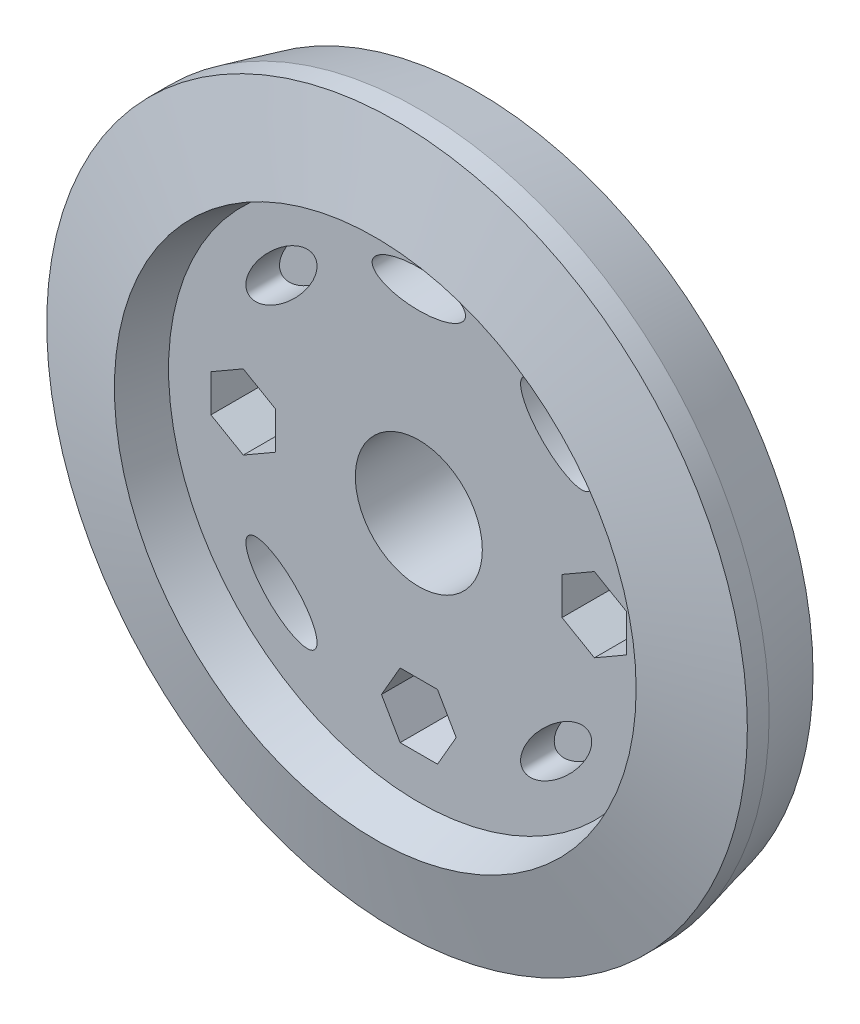
ISO-10303-21;
HEADER;
FILE_DESCRIPTION(('STEP AP214'),'2;1');
FILE_NAME('part.step','',(''),(''),'','','');
FILE_SCHEMA(('AUTOMOTIVE_DESIGN { 1 0 10303 214 1 1 1 1 }'));
ENDSEC;
DATA;
#1=APPLICATION_CONTEXT('core data for automotive mechanical design processes');
#2=APPLICATION_PROTOCOL_DEFINITION('international standard','automotive_design',2000,#1);
#3=PRODUCT_CONTEXT('',#1,'mechanical');
#4=PRODUCT('Part','Part','',(#3));
#5=PRODUCT_RELATED_PRODUCT_CATEGORY('part','',(#4));
#6=PRODUCT_DEFINITION_FORMATION('','',#4);
#7=PRODUCT_DEFINITION_CONTEXT('part definition',#1,'design');
#8=PRODUCT_DEFINITION('design','',#6,#7);
#9=PRODUCT_DEFINITION_SHAPE('','',#8);
#10=(LENGTH_UNIT() NAMED_UNIT(*) SI_UNIT(.MILLI.,.METRE.));
#11=(NAMED_UNIT(*) PLANE_ANGLE_UNIT() SI_UNIT($,.RADIAN.));
#12=(NAMED_UNIT(*) SI_UNIT($,.STERADIAN.) SOLID_ANGLE_UNIT());
#13=UNCERTAINTY_MEASURE_WITH_UNIT(LENGTH_MEASURE(1.E-05),#10,'distance_accuracy_value','');
#14=(GEOMETRIC_REPRESENTATION_CONTEXT(3) GLOBAL_UNCERTAINTY_ASSIGNED_CONTEXT((#13)) GLOBAL_UNIT_ASSIGNED_CONTEXT((#10,
#11,#12)) REPRESENTATION_CONTEXT('',''));
#15=CARTESIAN_POINT('',(0.,0.,0.));
#16=DIRECTION('',(0.,0.,1.));
#17=DIRECTION('',(1.,0.,0.));
#18=AXIS2_PLACEMENT_3D('',#15,#16,#17);
#19=CARTESIAN_POINT('',(0.,1701.8,394.866836272027));
#20=DIRECTION('',(0.,0.,-1.));
#21=DIRECTION('',(-1.,0.,0.));
#22=AXIS2_PLACEMENT_3D('',#19,#20,#21);
#23=PLANE('',#22);
#24=DIRECTION('',(-0.5,0.866025403784438,0.));
#25=VECTOR('',#24,1.);
#26=CARTESIAN_POINT('',(254.,-1193.8,394.866836272027));
#27=LINE('',#26,#25);
#28=CARTESIAN_POINT('',(254.,-1193.8,394.866836272027));
#29=VERTEX_POINT('',#28);
#30=CARTESIAN_POINT('',(127.,-973.829547438753,394.866836272027));
#31=VERTEX_POINT('',#30);
#32=EDGE_CURVE('E180',#29,#31,#27,.T.);
#33=ORIENTED_EDGE('',*,*,#32,.F.);
#34=DIRECTION('',(0.5,0.866025403784439,0.));
#35=VECTOR('',#34,1.);
#36=CARTESIAN_POINT('',(127.,-1413.77045256125,394.866836272027));
#37=LINE('',#36,#35);
#38=CARTESIAN_POINT('',(127.,-1413.77045256125,394.866836272027));
#39=VERTEX_POINT('',#38);
#40=EDGE_CURVE('E53',#39,#29,#37,.T.);
#41=ORIENTED_EDGE('',*,*,#40,.F.);
#42=DIRECTION('',(1.,0.,0.));
#43=VECTOR('',#42,1.);
#44=CARTESIAN_POINT('',(-127.,-1413.77045256125,394.866836272027));
#45=LINE('',#44,#43);
#46=CARTESIAN_POINT('',(-127.,-1413.77045256125,394.866836272027));
#47=VERTEX_POINT('',#46);
#48=EDGE_CURVE('E195',#47,#39,#45,.T.);
#49=ORIENTED_EDGE('',*,*,#48,.F.);
#50=DIRECTION('',(0.5,-0.866025403784439,0.));
#51=VECTOR('',#50,1.);
#52=CARTESIAN_POINT('',(-254.,-1193.8,394.866836272027));
#53=LINE('',#52,#51);
#54=CARTESIAN_POINT('',(-254.,-1193.8,394.866836272027));
#55=VERTEX_POINT('',#54);
#56=EDGE_CURVE('E189',#55,#47,#53,.T.);
#57=ORIENTED_EDGE('',*,*,#56,.F.);
#58=DIRECTION('',(-0.5,-0.866025403784439,0.));
#59=VECTOR('',#58,1.);
#60=CARTESIAN_POINT('',(-127.,-973.829547438753,394.866836272027));
#61=LINE('',#60,#59);
#62=CARTESIAN_POINT('',(-127.,-973.829547438753,394.866836272027));
#63=VERTEX_POINT('',#62);
#64=EDGE_CURVE('E187',#63,#55,#61,.T.);
#65=ORIENTED_EDGE('',*,*,#64,.F.);
#66=DIRECTION('',(-1.,0.,0.));
#67=VECTOR('',#66,1.);
#68=CARTESIAN_POINT('',(127.,-973.829547438753,394.866836272027));
#69=LINE('',#68,#67);
#70=EDGE_CURVE('E170',#31,#63,#69,.T.);
#71=ORIENTED_EDGE('',*,*,#70,.F.);
#72=EDGE_LOOP('',(#33,#41,#49,#57,#65,#71));
#73=FACE_BOUND('',#72,.T.);
#74=DIRECTION('',(0.86602540378444,0.499999999999997,0.));
#75=VECTOR('',#74,1.);
#76=CARTESIAN_POINT('',(-1193.8,-253.999999999996,394.866836272027));
#77=LINE('',#76,#75);
#78=CARTESIAN_POINT('',(-1193.8,-253.999999999996,394.866836272027));
#79=VERTEX_POINT('',#78);
#80=CARTESIAN_POINT('',(-973.829547438753,-126.999999999997,394.866836272027));
#81=VERTEX_POINT('',#80);
#82=EDGE_CURVE('E232',#79,#81,#77,.T.);
#83=ORIENTED_EDGE('',*,*,#82,.F.);
#84=DIRECTION('',(0.866025403784437,-0.500000000000003,0.));
#85=VECTOR('',#84,1.);
#86=CARTESIAN_POINT('',(-1413.77045256125,-126.999999999995,394.866836272027));
#87=LINE('',#86,#85);
#88=CARTESIAN_POINT('',(-1413.77045256125,-126.999999999995,394.866836272027));
#89=VERTEX_POINT('',#88);
#90=EDGE_CURVE('E61',#89,#79,#87,.T.);
#91=ORIENTED_EDGE('',*,*,#90,.F.);
#92=DIRECTION('',(0.,-1.,0.));
#93=VECTOR('',#92,1.);
#94=CARTESIAN_POINT('',(-1413.77045256125,127.000000000005,394.866836272027));
#95=LINE('',#94,#93);
#96=CARTESIAN_POINT('',(-1413.77045256125,127.000000000005,394.866836272027));
#97=VERTEX_POINT('',#96);
#98=EDGE_CURVE('E209',#97,#89,#95,.T.);
#99=ORIENTED_EDGE('',*,*,#98,.F.);
#100=DIRECTION('',(-0.86602540378444,-0.499999999999997,0.));
#101=VECTOR('',#100,1.);
#102=CARTESIAN_POINT('',(-1193.8,254.000000000004,394.866836272027));
#103=LINE('',#102,#101);
#104=CARTESIAN_POINT('',(-1193.8,254.000000000004,394.866836272027));
#105=VERTEX_POINT('',#104);
#106=EDGE_CURVE('E223',#105,#97,#103,.T.);
#107=ORIENTED_EDGE('',*,*,#106,.F.);
#108=DIRECTION('',(-0.866025403784437,0.500000000000003,0.));
#109=VECTOR('',#108,1.);
#110=CARTESIAN_POINT('',(-973.829547438752,127.000000000003,394.866836272027));
#111=LINE('',#110,#109);
#112=CARTESIAN_POINT('',(-973.829547438752,127.000000000003,394.866836272027));
#113=VERTEX_POINT('',#112);
#114=EDGE_CURVE('E226',#113,#105,#111,.T.);
#115=ORIENTED_EDGE('',*,*,#114,.F.);
#116=DIRECTION('',(0.,1.,0.));
#117=VECTOR('',#116,1.);
#118=CARTESIAN_POINT('',(-973.829547438753,-126.999999999997,394.866836272027));
#119=LINE('',#118,#117);
#120=EDGE_CURVE('E229',#81,#113,#119,.T.);
#121=ORIENTED_EDGE('',*,*,#120,.F.);
#122=EDGE_LOOP('',(#83,#91,#99,#107,#115,#121));
#123=FACE_BOUND('',#122,.T.);
#124=DIRECTION('',(-0.866025403784443,-0.499999999999991,0.));
#125=VECTOR('',#124,1.);
#126=CARTESIAN_POINT('',(1193.8,253.999999999988,394.866836272027));
#127=LINE('',#126,#125);
#128=CARTESIAN_POINT('',(1193.8,253.999999999987,394.866836272027));
#129=VERTEX_POINT('',#128);
#130=CARTESIAN_POINT('',(973.829547438754,126.99999999999,394.866836272027));
#131=VERTEX_POINT('',#130);
#132=EDGE_CURVE('E261',#129,#131,#127,.T.);
#133=ORIENTED_EDGE('',*,*,#132,.F.);
#134=DIRECTION('',(-0.866025403784433,0.500000000000009,0.));
#135=VECTOR('',#134,1.);
#136=CARTESIAN_POINT('',(1413.77045256125,126.999999999985,394.866836272027));
#137=LINE('',#136,#135);
#138=CARTESIAN_POINT('',(1413.77045256125,126.999999999985,394.866836272027));
#139=VERTEX_POINT('',#138);
#140=EDGE_CURVE('E220',#139,#129,#137,.T.);
#141=ORIENTED_EDGE('',*,*,#140,.F.);
#142=DIRECTION('',(0.,1.,0.));
#143=VECTOR('',#142,1.);
#144=CARTESIAN_POINT('',(1413.77045256125,-127.000000000015,394.866836272027));
#145=LINE('',#144,#143);
#146=CARTESIAN_POINT('',(1413.77045256125,-127.000000000015,394.866836272027));
#147=VERTEX_POINT('',#146);
#148=EDGE_CURVE('E239',#147,#139,#145,.T.);
#149=ORIENTED_EDGE('',*,*,#148,.F.);
#150=DIRECTION('',(0.866025403784444,0.499999999999991,0.));
#151=VECTOR('',#150,1.);
#152=CARTESIAN_POINT('',(1193.8,-254.000000000012,394.866836272027));
#153=LINE('',#152,#151);
#154=CARTESIAN_POINT('',(1193.8,-254.000000000012,394.866836272027));
#155=VERTEX_POINT('',#154);
#156=EDGE_CURVE('E252',#155,#147,#153,.T.);
#157=ORIENTED_EDGE('',*,*,#156,.F.);
#158=DIRECTION('',(0.866025403784434,-0.500000000000009,0.));
#159=VECTOR('',#158,1.);
#160=CARTESIAN_POINT('',(973.829547438751,-127.00000000001,394.866836272027));
#161=LINE('',#160,#159);
#162=CARTESIAN_POINT('',(973.829547438751,-127.00000000001,394.866836272027));
#163=VERTEX_POINT('',#162);
#164=EDGE_CURVE('E255',#163,#155,#161,.T.);
#165=ORIENTED_EDGE('',*,*,#164,.F.);
#166=DIRECTION('',(0.,-1.,0.));
#167=VECTOR('',#166,1.);
#168=CARTESIAN_POINT('',(973.829547438754,126.99999999999,394.866836272027));
#169=LINE('',#168,#167);
#170=EDGE_CURVE('E258',#131,#163,#169,.T.);
#171=ORIENTED_EDGE('',*,*,#170,.F.);
#172=EDGE_LOOP('',(#133,#141,#149,#157,#165,#171));
#173=FACE_BOUND('',#172,.T.);
#174=CARTESIAN_POINT('',(0.,1320.8,394.866836272027));
#175=DIRECTION('',(0.,0.,1.));
#176=DIRECTION('',(1.,0.,0.));
#177=AXIS2_PLACEMENT_3D('',#174,#175,#176);
#178=ELLIPSE('',#177,317.5,127.);
#179=CARTESIAN_POINT('',(317.5,1320.8,394.866836272027));
#180=VERTEX_POINT('',#179);
#181=EDGE_CURVE('E270',#180,#180,#178,.T.);
#182=ORIENTED_EDGE('',*,*,#181,.F.);
#183=EDGE_LOOP('',(#182));
#184=FACE_BOUND('',#183,.T.);
#185=CARTESIAN_POINT('',(933.946636591248,933.946636591249,394.866836272027));
#186=DIRECTION('',(0.,0.,1.));
#187=DIRECTION('',(0.707106781186547,-0.707106781186548,0.));
#188=AXIS2_PLACEMENT_3D('',#185,#186,#187);
#189=ELLIPSE('',#188,317.5,127.);
#190=CARTESIAN_POINT('',(1158.45303961798,709.44023356452,394.866836272027));
#191=VERTEX_POINT('',#190);
#192=EDGE_CURVE('E292',#191,#191,#189,.T.);
#193=ORIENTED_EDGE('',*,*,#192,.F.);
#194=EDGE_LOOP('',(#193));
#195=FACE_BOUND('',#194,.T.);
#196=CARTESIAN_POINT('',(933.94663659135,-933.946636591146,394.866836272027));
#197=DIRECTION('',(0.,0.,1.));
#198=DIRECTION('',(-0.707106781186547,-0.707106781186548,0.));
#199=AXIS2_PLACEMENT_3D('',#196,#197,#198);
#200=ELLIPSE('',#199,317.5,127.);
#201=CARTESIAN_POINT('',(709.440233564622,-1158.45303961788,394.866836272027));
#202=VERTEX_POINT('',#201);
#203=EDGE_CURVE('E293',#202,#202,#200,.T.);
#204=ORIENTED_EDGE('',*,*,#203,.F.);
#205=EDGE_LOOP('',(#204));
#206=FACE_BOUND('',#205,.T.);
#207=CARTESIAN_POINT('',(-933.946636591044,-933.946636591249,394.866836272027));
#208=DIRECTION('',(0.,0.,1.));
#209=DIRECTION('',(-0.707106781186548,0.707106781186548,0.));
#210=AXIS2_PLACEMENT_3D('',#207,#208,#209);
#211=ELLIPSE('',#210,317.5,127.);
#212=CARTESIAN_POINT('',(-1158.45303961777,-709.44023356452,394.866836272027));
#213=VERTEX_POINT('',#212);
#214=EDGE_CURVE('E300',#213,#213,#211,.T.);
#215=ORIENTED_EDGE('',*,*,#214,.F.);
#216=EDGE_LOOP('',(#215));
#217=FACE_BOUND('',#216,.T.);
#218=CARTESIAN_POINT('',(-933.946636591147,933.946636591147,394.866836272027));
#219=DIRECTION('',(0.,0.,1.));
#220=DIRECTION('',(0.707106781186548,0.707106781186548,0.));
#221=AXIS2_PLACEMENT_3D('',#218,#219,#220);
#222=ELLIPSE('',#221,317.5,127.);
#223=CARTESIAN_POINT('',(-709.440233564418,1158.45303961788,394.866836272027));
#224=VERTEX_POINT('',#223);
#225=EDGE_CURVE('E320',#224,#224,#222,.T.);
#226=ORIENTED_EDGE('',*,*,#225,.F.);
#227=EDGE_LOOP('',(#226));
#228=FACE_BOUND('',#227,.T.);
#229=CARTESIAN_POINT('',(0.,0.,394.866836272027));
#230=DIRECTION('',(0.,0.,1.));
#231=DIRECTION('',(1.,0.,0.));
#232=AXIS2_PLACEMENT_3D('',#229,#230,#231);
#233=CIRCLE('',#232,431.8);
#234=CARTESIAN_POINT('',(431.8,0.,394.866836272027));
#235=VERTEX_POINT('',#234);
#236=EDGE_CURVE('E373',#235,#235,#233,.T.);
#237=ORIENTED_EDGE('',*,*,#236,.F.);
#238=EDGE_LOOP('',(#237));
#239=FACE_BOUND('',#238,.T.);
#240=CARTESIAN_POINT('',(0.,0.,394.866836272027));
#241=DIRECTION('',(0.,0.,1.));
#242=DIRECTION('',(1.,0.,0.));
#243=AXIS2_PLACEMENT_3D('',#240,#241,#242);
#244=CIRCLE('',#243,1701.8);
#245=CARTESIAN_POINT('',(1701.8,0.,394.866836272027));
#246=VERTEX_POINT('',#245);
#247=EDGE_CURVE('E269',#246,#246,#244,.T.);
#248=ORIENTED_EDGE('',*,*,#247,.T.);
#249=EDGE_LOOP('',(#248));
#250=FACE_BOUND('',#249,.T.);
#251=ADVANCED_FACE('F39',(#73,#123,#173,#184,#195,#206,#217,#228,#239,#250),#23,.F.);
#252=CARTESIAN_POINT('',(0.,0.,0.));
#253=DIRECTION('',(0.,0.,1.));
#254=DIRECTION('',(1.,0.,0.));
#255=AXIS2_PLACEMENT_3D('',#252,#253,#254);
#256=CYLINDRICAL_SURFACE('',#255,431.8);
#257=CARTESIAN_POINT('',(0.,0.,-394.866836272027));
#258=DIRECTION('',(0.,0.,1.));
#259=DIRECTION('',(1.,0.,0.));
#260=AXIS2_PLACEMENT_3D('',#257,#258,#259);
#261=CIRCLE('',#260,431.8);
#262=CARTESIAN_POINT('',(431.8,0.,-394.866836272027));
#263=VERTEX_POINT('',#262);
#264=EDGE_CURVE('E370',#263,#263,#261,.T.);
#265=ORIENTED_EDGE('',*,*,#264,.F.);
#266=EDGE_LOOP('',(#265));
#267=FACE_BOUND('',#266,.T.);
#268=ORIENTED_EDGE('',*,*,#236,.T.);
#269=EDGE_LOOP('',(#268));
#270=FACE_BOUND('',#269,.T.);
#271=ADVANCED_FACE('F360',(#267,#270),#256,.F.);
#272=CARTESIAN_POINT('',(0.,431.8,-394.866836272027));
#273=DIRECTION('',(0.,0.,1.));
#274=DIRECTION('',(1.,0.,0.));
#275=AXIS2_PLACEMENT_3D('',#272,#273,#274);
#276=PLANE('',#275);
#277=CARTESIAN_POINT('',(0.,0.,-394.866836272027));
#278=DIRECTION('',(0.,0.,1.));
#279=DIRECTION('',(1.,0.,0.));
#280=AXIS2_PLACEMENT_3D('',#277,#278,#279);
#281=CIRCLE('',#280,889.);
#282=CARTESIAN_POINT('',(889.,0.,-394.866836272027));
#283=VERTEX_POINT('',#282);
#284=EDGE_CURVE('E380',#283,#283,#281,.T.);
#285=ORIENTED_EDGE('',*,*,#284,.F.);
#286=EDGE_LOOP('',(#285));
#287=FACE_BOUND('',#286,.T.);
#288=ORIENTED_EDGE('',*,*,#264,.T.);
#289=EDGE_LOOP('',(#288));
#290=FACE_BOUND('',#289,.T.);
#291=ADVANCED_FACE('F357',(#287,#290),#276,.F.);
#292=CARTESIAN_POINT('',(0.,0.,0.));
#293=DIRECTION('',(0.,0.,1.));
#294=DIRECTION('',(1.,0.,0.));
#295=AXIS2_PLACEMENT_3D('',#292,#293,#294);
#296=CYLINDRICAL_SURFACE('',#295,889.);
#297=CARTESIAN_POINT('',(0.,0.,0.));
#298=DIRECTION('',(0.,0.,1.));
#299=DIRECTION('',(1.,0.,0.));
#300=AXIS2_PLACEMENT_3D('',#297,#298,#299);
#301=CIRCLE('',#300,889.);
#302=CARTESIAN_POINT('',(889.,0.,0.));
#303=VERTEX_POINT('',#302);
#304=EDGE_CURVE('E515',#303,#303,#301,.T.);
#305=ORIENTED_EDGE('',*,*,#304,.F.);
#306=EDGE_LOOP('',(#305));
#307=FACE_BOUND('',#306,.T.);
#308=ORIENTED_EDGE('',*,*,#284,.T.);
#309=EDGE_LOOP('',(#308));
#310=FACE_BOUND('',#309,.T.);
#311=ADVANCED_FACE('F353',(#307,#310),#296,.T.);
#312=CARTESIAN_POINT('',(0.,889.,0.));
#313=DIRECTION('',(0.,0.,1.));
#314=DIRECTION('',(1.,0.,0.));
#315=AXIS2_PLACEMENT_3D('',#312,#313,#314);
#316=PLANE('',#315);
#317=DIRECTION('',(1.,0.,0.));
#318=VECTOR('',#317,1.);
#319=CARTESIAN_POINT('',(0.,-1413.77045256125,0.));
#320=LINE('',#319,#318);
#321=CARTESIAN_POINT('',(-127.,-1413.77045256125,-1.11022302462516E-13));
#322=VERTEX_POINT('',#321);
#323=CARTESIAN_POINT('',(127.,-1413.77045256125,-1.11022302462516E-13));
#324=VERTEX_POINT('',#323);
#325=EDGE_CURVE('E46',#322,#324,#320,.T.);
#326=ORIENTED_EDGE('',*,*,#325,.T.);
#327=DIRECTION('',(0.5,0.866025403784439,0.));
#328=VECTOR('',#327,1.);
#329=CARTESIAN_POINT('',(1092.37885550111,258.314773719377,0.));
#330=LINE('',#329,#328);
#331=CARTESIAN_POINT('',(254.,-1193.8,-1.11022302462516E-13));
#332=VERTEX_POINT('',#331);
#333=EDGE_CURVE('E11',#324,#332,#330,.T.);
#334=ORIENTED_EDGE('',*,*,#333,.T.);
#335=DIRECTION('',(-0.5,0.866025403784438,0.));
#336=VECTOR('',#335,1.);
#337=CARTESIAN_POINT('',(-711.378855501115,478.285226280623,0.));
#338=LINE('',#337,#336);
#339=CARTESIAN_POINT('',(127.,-973.829547438753,0.));
#340=VERTEX_POINT('',#339);
#341=EDGE_CURVE('E416',#332,#340,#338,.T.);
#342=ORIENTED_EDGE('',*,*,#341,.T.);
#343=DIRECTION('',(-1.,0.,0.));
#344=VECTOR('',#343,1.);
#345=CARTESIAN_POINT('',(0.,-973.829547438753,0.));
#346=LINE('',#345,#344);
#347=CARTESIAN_POINT('',(-127.,-973.829547438753,-1.11022302462516E-13));
#348=VERTEX_POINT('',#347);
#349=EDGE_CURVE('E173',#340,#348,#346,.T.);
#350=ORIENTED_EDGE('',*,*,#349,.T.);
#351=DIRECTION('',(-0.5,-0.866025403784439,0.));
#352=VECTOR('',#351,1.);
#353=CARTESIAN_POINT('',(711.378855501114,478.285226280624,0.));
#354=LINE('',#353,#352);
#355=CARTESIAN_POINT('',(-254.,-1193.8,-1.11022302462516E-13));
#356=VERTEX_POINT('',#355);
#357=EDGE_CURVE('E419',#348,#356,#354,.T.);
#358=ORIENTED_EDGE('',*,*,#357,.T.);
#359=DIRECTION('',(0.5,-0.866025403784439,0.));
#360=VECTOR('',#359,1.);
#361=CARTESIAN_POINT('',(-1092.37885550111,258.314773719377,0.));
#362=LINE('',#361,#360);
#363=EDGE_CURVE('E422',#356,#322,#362,.T.);
#364=ORIENTED_EDGE('',*,*,#363,.T.);
#365=EDGE_LOOP('',(#326,#334,#342,#350,#358,#364));
#366=FACE_BOUND('',#365,.T.);
#367=DIRECTION('',(0.,-1.,0.));
#368=VECTOR('',#367,1.);
#369=CARTESIAN_POINT('',(-1413.77045256124,889.000000000005,0.));
#370=LINE('',#369,#368);
#371=CARTESIAN_POINT('',(-1413.77045256125,127.000000000005,-1.11022302462516E-13));
#372=VERTEX_POINT('',#371);
#373=CARTESIAN_POINT('',(-1413.77045256125,-126.999999999995,-1.11022302462516E-13));
#374=VERTEX_POINT('',#373);
#375=EDGE_CURVE('E410',#372,#374,#370,.T.);
#376=ORIENTED_EDGE('',*,*,#375,.T.);
#377=DIRECTION('',(0.866025403784437,-0.500000000000003,0.));
#378=VECTOR('',#377,1.);
#379=CARTESIAN_POINT('',(-793.38351826281,-485.180563518927,0.));
#380=LINE('',#379,#378);
#381=CARTESIAN_POINT('',(-1193.8,-253.999999999996,-1.11022302462516E-13));
#382=VERTEX_POINT('',#381);
#383=EDGE_CURVE('E413',#374,#382,#380,.T.);
#384=ORIENTED_EDGE('',*,*,#383,.T.);
#385=DIRECTION('',(0.86602540378444,0.499999999999997,0.));
#386=VECTOR('',#385,1.);
#387=CARTESIAN_POINT('',(196.483518262806,548.68056351893,0.));
#388=LINE('',#387,#386);
#389=CARTESIAN_POINT('',(-973.829547438753,-126.999999999997,0.));
#390=VERTEX_POINT('',#389);
#391=EDGE_CURVE('E398',#382,#390,#388,.T.);
#392=ORIENTED_EDGE('',*,*,#391,.T.);
#393=DIRECTION('',(0.,1.,0.));
#394=VECTOR('',#393,1.);
#395=CARTESIAN_POINT('',(-973.82954743875,889.000000000003,0.));
#396=LINE('',#395,#394);
#397=CARTESIAN_POINT('',(-973.829547438752,127.000000000003,-1.11022302462516E-13));
#398=VERTEX_POINT('',#397);
#399=EDGE_CURVE('E401',#390,#398,#396,.T.);
#400=ORIENTED_EDGE('',*,*,#399,.T.);
#401=DIRECTION('',(-0.866025403784437,0.500000000000003,0.));
#402=VECTOR('',#401,1.);
#403=CARTESIAN_POINT('',(-573.413065701562,-104.180563518928,0.));
#404=LINE('',#403,#402);
#405=CARTESIAN_POINT('',(-1193.8,254.000000000004,-1.11022302462516E-13));
#406=VERTEX_POINT('',#405);
#407=EDGE_CURVE('E404',#398,#406,#404,.T.);
#408=ORIENTED_EDGE('',*,*,#407,.T.);
#409=DIRECTION('',(-0.86602540378444,-0.499999999999997,0.));
#410=VECTOR('',#409,1.);
#411=CARTESIAN_POINT('',(-23.4869342984396,929.68056351893,0.));
#412=LINE('',#411,#410);
#413=EDGE_CURVE('E407',#406,#372,#412,.T.);
#414=ORIENTED_EDGE('',*,*,#413,.T.);
#415=EDGE_LOOP('',(#376,#384,#392,#400,#408,#414));
#416=FACE_BOUND('',#415,.T.);
#417=DIRECTION('',(0.,1.,0.));
#418=VECTOR('',#417,1.);
#419=CARTESIAN_POINT('',(1413.77045256126,888.999999999985,0.));
#420=LINE('',#419,#418);
#421=CARTESIAN_POINT('',(1413.77045256125,-127.000000000015,-1.11022302462516E-13));
#422=VERTEX_POINT('',#421);
#423=CARTESIAN_POINT('',(1413.77045256125,126.999999999985,-1.11022302462516E-13));
#424=VERTEX_POINT('',#423);
#425=EDGE_CURVE('E392',#422,#424,#420,.T.);
#426=ORIENTED_EDGE('',*,*,#425,.T.);
#427=DIRECTION('',(-0.866025403784434,0.500000000000009,0.));
#428=VECTOR('',#427,1.);
#429=CARTESIAN_POINT('',(23.4869342984434,929.680563518935,0.));
#430=LINE('',#429,#428);
#431=CARTESIAN_POINT('',(1193.8,253.999999999988,-1.11022302462516E-13));
#432=VERTEX_POINT('',#431);
#433=EDGE_CURVE('E395',#424,#432,#430,.T.);
#434=ORIENTED_EDGE('',*,*,#433,.T.);
#435=DIRECTION('',(-0.866025403784444,-0.499999999999991,0.));
#436=VECTOR('',#435,1.);
#437=CARTESIAN_POINT('',(573.413065701552,-104.180563518941,0.));
#438=LINE('',#437,#436);
#439=CARTESIAN_POINT('',(973.829547438754,126.99999999999,0.));
#440=VERTEX_POINT('',#439);
#441=EDGE_CURVE('E375',#432,#440,#438,.T.);
#442=ORIENTED_EDGE('',*,*,#441,.T.);
#443=DIRECTION('',(0.,-1.,0.));
#444=VECTOR('',#443,1.);
#445=CARTESIAN_POINT('',(973.829547438762,888.99999999999,0.));
#446=LINE('',#445,#444);
#447=CARTESIAN_POINT('',(973.829547438751,-127.00000000001,-1.11022302462516E-13));
#448=VERTEX_POINT('',#447);
#449=EDGE_CURVE('E378',#440,#448,#446,.T.);
#450=ORIENTED_EDGE('',*,*,#449,.T.);
#451=DIRECTION('',(0.866025403784434,-0.500000000000009,0.));
#452=VECTOR('',#451,1.);
#453=CARTESIAN_POINT('',(-196.483518262808,548.680563518937,0.));
#454=LINE('',#453,#452);
#455=CARTESIAN_POINT('',(1193.8,-254.000000000012,-1.11022302462516E-13));
#456=VERTEX_POINT('',#455);
#457=EDGE_CURVE('E386',#448,#456,#454,.T.);
#458=ORIENTED_EDGE('',*,*,#457,.T.);
#459=DIRECTION('',(0.866025403784444,0.499999999999991,0.));
#460=VECTOR('',#459,1.);
#461=CARTESIAN_POINT('',(793.383518262794,-485.180563518944,0.));
#462=LINE('',#461,#460);
#463=EDGE_CURVE('E389',#456,#422,#462,.T.);
#464=ORIENTED_EDGE('',*,*,#463,.T.);
#465=EDGE_LOOP('',(#426,#434,#442,#450,#458,#464));
#466=FACE_BOUND('',#465,.T.);
#467=CARTESIAN_POINT('',(0.,0.,0.));
#468=DIRECTION('',(0.,0.,1.));
#469=DIRECTION('',(1.,0.,0.));
#470=AXIS2_PLACEMENT_3D('',#467,#468,#469);
#471=CIRCLE('',#470,2286.);
#472=CARTESIAN_POINT('',(2286.,0.,0.));
#473=VERTEX_POINT('',#472);
#474=EDGE_CURVE('E512',#473,#473,#471,.T.);
#475=ORIENTED_EDGE('',*,*,#474,.F.);
#476=EDGE_LOOP('',(#475));
#477=FACE_BOUND('',#476,.T.);
#478=ORIENTED_EDGE('',*,*,#304,.T.);
#479=EDGE_LOOP('',(#478));
#480=FACE_BOUND('',#479,.T.);
#481=ADVANCED_FACE('F349',(#366,#416,#466,#477,#480),#316,.F.);
#482=CARTESIAN_POINT('',(0.,0.,0.));
#483=DIRECTION('',(0.,0.,1.));
#484=DIRECTION('',(1.,0.,0.));
#485=AXIS2_PLACEMENT_3D('',#482,#483,#484);
#486=CONICAL_SURFACE('',#485,2286.,0.238805776316272);
#487=CARTESIAN_POINT('',(0.,0.,394.866836272027));
#488=DIRECTION('',(0.,0.,1.));
#489=DIRECTION('',(1.,0.,0.));
#490=AXIS2_PLACEMENT_3D('',#487,#488,#489);
#491=CIRCLE('',#490,2382.13085671375);
#492=CARTESIAN_POINT('',(2382.13085671375,0.,394.866836272027));
#493=VERTEX_POINT('',#492);
#494=EDGE_CURVE('E518',#493,#493,#491,.T.);
#495=ORIENTED_EDGE('',*,*,#494,.F.);
#496=EDGE_LOOP('',(#495));
#497=FACE_BOUND('',#496,.T.);
#498=ORIENTED_EDGE('',*,*,#474,.T.);
#499=EDGE_LOOP('',(#498));
#500=FACE_BOUND('',#499,.T.);
#501=ADVANCED_FACE('F345',(#497,#500),#486,.T.);
#502=CARTESIAN_POINT('',(0.,0.,0.));
#503=DIRECTION('',(0.,0.,1.));
#504=DIRECTION('',(1.,0.,0.));
#505=AXIS2_PLACEMENT_3D('',#502,#503,#504);
#506=CYLINDRICAL_SURFACE('',#505,2382.13085671375);
#507=CARTESIAN_POINT('',(0.,0.,542.941899874037));
#508=DIRECTION('',(0.,0.,1.));
#509=DIRECTION('',(1.,0.,0.));
#510=AXIS2_PLACEMENT_3D('',#507,#508,#509);
#511=CIRCLE('',#510,2382.13085671375);
#512=CARTESIAN_POINT('',(2382.13085671375,0.,542.941899874037));
#513=VERTEX_POINT('',#512);
#514=EDGE_CURVE('E523',#513,#513,#511,.T.);
#515=ORIENTED_EDGE('',*,*,#514,.F.);
#516=EDGE_LOOP('',(#515));
#517=FACE_BOUND('',#516,.T.);
#518=ORIENTED_EDGE('',*,*,#494,.T.);
#519=EDGE_LOOP('',(#518));
#520=FACE_BOUND('',#519,.T.);
#521=ADVANCED_FACE('F341',(#517,#520),#506,.T.);
#522=CARTESIAN_POINT('',(0.,0.,542.941899874037));
#523=DIRECTION('',(0.,0.,-1.));
#524=DIRECTION('',(-1.,0.,0.));
#525=AXIS2_PLACEMENT_3D('',#522,#523,#524);
#526=CONICAL_SURFACE('',#525,2382.13085671375,1.33199055047863);
#527=CARTESIAN_POINT('',(0.,0.,691.016963476047));
#528=DIRECTION('',(0.,0.,1.));
#529=DIRECTION('',(1.,0.,0.));
#530=AXIS2_PLACEMENT_3D('',#527,#528,#529);
#531=CIRCLE('',#530,1773.89814253532);
#532=CARTESIAN_POINT('',(1773.89814253532,0.,691.016963476047));
#533=VERTEX_POINT('',#532);
#534=EDGE_CURVE('E525',#533,#533,#531,.T.);
#535=ORIENTED_EDGE('',*,*,#534,.F.);
#536=EDGE_LOOP('',(#535));
#537=FACE_BOUND('',#536,.T.);
#538=ORIENTED_EDGE('',*,*,#514,.T.);
#539=EDGE_LOOP('',(#538));
#540=FACE_BOUND('',#539,.T.);
#541=ADVANCED_FACE('F337',(#537,#540),#526,.T.);
#542=CARTESIAN_POINT('',(0.,0.,691.016963476047));
#543=DIRECTION('',(0.,0.,1.));
#544=DIRECTION('',(1.,0.,0.));
#545=AXIS2_PLACEMENT_3D('',#542,#543,#544);
#546=CONICAL_SURFACE('',#545,1773.89814253532,0.238805776316272);
#547=ORIENTED_EDGE('',*,*,#247,.F.);
#548=EDGE_LOOP('',(#547));
#549=FACE_BOUND('',#548,.T.);
#550=ORIENTED_EDGE('',*,*,#534,.T.);
#551=EDGE_LOOP('',(#550));
#552=FACE_BOUND('',#551,.T.);
#553=ADVANCED_FACE('F330',(#549,#552),#546,.F.);
#554=CARTESIAN_POINT('',(-933.946636591147,933.946636591147,166.266836272027));
#555=DIRECTION('',(0.,0.,1.));
#556=DIRECTION('',(0.707106781186548,0.707106781186548,0.));
#557=AXIS2_PLACEMENT_3D('',#554,#555,#556);
#558=ELLIPSE('',#557,317.5,127.);
#559=DIRECTION('',(0.,0.,1.));
#560=VECTOR('',#559,1.);
#561=SURFACE_OF_LINEAR_EXTRUSION('',#558,#560);
#562=CARTESIAN_POINT('',(-709.440233564418,1158.45303961788,166.266836272027));
#563=VERTEX_POINT('',#562);
#564=EDGE_CURVE('E200',#563,#563,#558,.T.);
#565=ORIENTED_EDGE('',*,*,#564,.F.);
#566=EDGE_LOOP('',(#565));
#567=FACE_BOUND('',#566,.T.);
#568=ORIENTED_EDGE('',*,*,#225,.T.);
#569=EDGE_LOOP('',(#568));
#570=FACE_BOUND('',#569,.T.);
#571=ADVANCED_FACE('F327',(#567,#570),#561,.F.);
#572=CARTESIAN_POINT('',(-933.946636591147,933.946636591147,166.266836272027));
#573=DIRECTION('',(0.,0.,1.));
#574=DIRECTION('',(1.,0.,0.));
#575=AXIS2_PLACEMENT_3D('',#572,#573,#574);
#576=PLANE('',#575);
#577=ORIENTED_EDGE('',*,*,#564,.T.);
#578=EDGE_LOOP('',(#577));
#579=FACE_BOUND('',#578,.T.);
#580=ADVANCED_FACE('F313',(#579),#576,.T.);
#581=CARTESIAN_POINT('',(-933.946636591044,-933.946636591249,166.266836272027));
#582=DIRECTION('',(0.,0.,1.));
#583=DIRECTION('',(-0.707106781186548,0.707106781186548,0.));
#584=AXIS2_PLACEMENT_3D('',#581,#582,#583);
#585=ELLIPSE('',#584,317.5,127.);
#586=DIRECTION('',(0.,0.,1.));
#587=VECTOR('',#586,1.);
#588=SURFACE_OF_LINEAR_EXTRUSION('',#585,#587);
#589=CARTESIAN_POINT('',(-1158.45303961777,-709.44023356452,166.266836272027));
#590=VERTEX_POINT('',#589);
#591=EDGE_CURVE('E316',#590,#590,#585,.T.);
#592=ORIENTED_EDGE('',*,*,#591,.F.);
#593=EDGE_LOOP('',(#592));
#594=FACE_BOUND('',#593,.T.);
#595=ORIENTED_EDGE('',*,*,#214,.T.);
#596=EDGE_LOOP('',(#595));
#597=FACE_BOUND('',#596,.T.);
#598=ADVANCED_FACE('F310',(#594,#597),#588,.F.);
#599=CARTESIAN_POINT('',(-933.946636591044,-933.946636591249,166.266836272027));
#600=DIRECTION('',(0.,0.,1.));
#601=DIRECTION('',(1.,0.,0.));
#602=AXIS2_PLACEMENT_3D('',#599,#600,#601);
#603=PLANE('',#602);
#604=ORIENTED_EDGE('',*,*,#591,.T.);
#605=EDGE_LOOP('',(#604));
#606=FACE_BOUND('',#605,.T.);
#607=ADVANCED_FACE('F305',(#606),#603,.T.);
#608=CARTESIAN_POINT('',(933.94663659135,-933.946636591146,166.266836272027));
#609=DIRECTION('',(0.,0.,1.));
#610=DIRECTION('',(-0.707106781186547,-0.707106781186548,0.));
#611=AXIS2_PLACEMENT_3D('',#608,#609,#610);
#612=ELLIPSE('',#611,317.5,127.);
#613=DIRECTION('',(0.,0.,1.));
#614=VECTOR('',#613,1.);
#615=SURFACE_OF_LINEAR_EXTRUSION('',#612,#614);
#616=CARTESIAN_POINT('',(709.440233564622,-1158.45303961788,166.266836272027));
#617=VERTEX_POINT('',#616);
#618=EDGE_CURVE('E296',#617,#617,#612,.T.);
#619=ORIENTED_EDGE('',*,*,#618,.F.);
#620=EDGE_LOOP('',(#619));
#621=FACE_BOUND('',#620,.T.);
#622=ORIENTED_EDGE('',*,*,#203,.T.);
#623=EDGE_LOOP('',(#622));
#624=FACE_BOUND('',#623,.T.);
#625=ADVANCED_FACE('F302',(#621,#624),#615,.F.);
#626=CARTESIAN_POINT('',(933.94663659135,-933.946636591146,166.266836272027));
#627=DIRECTION('',(0.,0.,1.));
#628=DIRECTION('',(1.,0.,0.));
#629=AXIS2_PLACEMENT_3D('',#626,#627,#628);
#630=PLANE('',#629);
#631=ORIENTED_EDGE('',*,*,#618,.T.);
#632=EDGE_LOOP('',(#631));
#633=FACE_BOUND('',#632,.T.);
#634=ADVANCED_FACE('F285',(#633),#630,.T.);
#635=CARTESIAN_POINT('',(933.946636591248,933.946636591249,166.266836272027));
#636=DIRECTION('',(0.,0.,1.));
#637=DIRECTION('',(0.707106781186547,-0.707106781186548,0.));
#638=AXIS2_PLACEMENT_3D('',#635,#636,#637);
#639=ELLIPSE('',#638,317.5,127.);
#640=DIRECTION('',(0.,0.,1.));
#641=VECTOR('',#640,1.);
#642=SURFACE_OF_LINEAR_EXTRUSION('',#639,#641);
#643=CARTESIAN_POINT('',(1158.45303961798,709.44023356452,166.266836272027));
#644=VERTEX_POINT('',#643);
#645=EDGE_CURVE('E288',#644,#644,#639,.T.);
#646=ORIENTED_EDGE('',*,*,#645,.F.);
#647=EDGE_LOOP('',(#646));
#648=FACE_BOUND('',#647,.T.);
#649=ORIENTED_EDGE('',*,*,#192,.T.);
#650=EDGE_LOOP('',(#649));
#651=FACE_BOUND('',#650,.T.);
#652=ADVANCED_FACE('F281',(#648,#651),#642,.F.);
#653=CARTESIAN_POINT('',(933.946636591248,933.946636591249,166.266836272027));
#654=DIRECTION('',(0.,0.,1.));
#655=DIRECTION('',(1.,0.,0.));
#656=AXIS2_PLACEMENT_3D('',#653,#654,#655);
#657=PLANE('',#656);
#658=ORIENTED_EDGE('',*,*,#645,.T.);
#659=EDGE_LOOP('',(#658));
#660=FACE_BOUND('',#659,.T.);
#661=ADVANCED_FACE('F278',(#660),#657,.T.);
#662=CARTESIAN_POINT('',(0.,1320.8,166.266836272027));
#663=DIRECTION('',(0.,0.,1.));
#664=DIRECTION('',(1.,0.,0.));
#665=AXIS2_PLACEMENT_3D('',#662,#663,#664);
#666=ELLIPSE('',#665,317.5,127.);
#667=DIRECTION('',(0.,0.,1.));
#668=VECTOR('',#667,1.);
#669=SURFACE_OF_LINEAR_EXTRUSION('',#666,#668);
#670=CARTESIAN_POINT('',(317.5,1320.8,166.266836272027));
#671=VERTEX_POINT('',#670);
#672=EDGE_CURVE('E265',#671,#671,#666,.T.);
#673=ORIENTED_EDGE('',*,*,#672,.F.);
#674=EDGE_LOOP('',(#673));
#675=FACE_BOUND('',#674,.T.);
#676=ORIENTED_EDGE('',*,*,#181,.T.);
#677=EDGE_LOOP('',(#676));
#678=FACE_BOUND('',#677,.T.);
#679=ADVANCED_FACE('F273',(#675,#678),#669,.F.);
#680=CARTESIAN_POINT('',(0.,1320.8,166.266836272027));
#681=DIRECTION('',(0.,0.,1.));
#682=DIRECTION('',(1.,0.,0.));
#683=AXIS2_PLACEMENT_3D('',#680,#681,#682);
#684=PLANE('',#683);
#685=ORIENTED_EDGE('',*,*,#672,.T.);
#686=EDGE_LOOP('',(#685));
#687=FACE_BOUND('',#686,.T.);
#688=ADVANCED_FACE('F277',(#687),#684,.T.);
#689=CARTESIAN_POINT('',(1413.77045256125,126.999999999985,-394.866836272027));
#690=DIRECTION('',(0.500000000000009,0.866025403784433,0.));
#691=DIRECTION('',(-0.866025403784434,0.500000000000009,0.));
#692=AXIS2_PLACEMENT_3D('',#689,#690,#691);
#693=PLANE('',#692);
#694=DIRECTION('',(0.,0.,1.));
#695=VECTOR('',#694,1.);
#696=CARTESIAN_POINT('',(1413.77045256125,126.999999999985,-394.866836272027));
#697=LINE('',#696,#695);
#698=EDGE_CURVE('E248',#424,#139,#697,.T.);
#699=ORIENTED_EDGE('',*,*,#698,.T.);
#700=ORIENTED_EDGE('',*,*,#140,.T.);
#701=DIRECTION('',(0.,0.,1.));
#702=VECTOR('',#701,1.);
#703=CARTESIAN_POINT('',(1193.8,253.999999999988,-394.866836272027));
#704=LINE('',#703,#702);
#705=EDGE_CURVE('E236',#432,#129,#704,.T.);
#706=ORIENTED_EDGE('',*,*,#705,.F.);
#707=ORIENTED_EDGE('',*,*,#433,.F.);
#708=EDGE_LOOP('',(#699,#700,#706,#707));
#709=FACE_BOUND('',#708,.T.);
#710=ADVANCED_FACE('F470',(#709),#693,.F.);
#711=CARTESIAN_POINT('',(1413.77045256125,-127.000000000015,-394.866836272027));
#712=DIRECTION('',(1.,0.,0.));
#713=DIRECTION('',(0.,1.,0.));
#714=AXIS2_PLACEMENT_3D('',#711,#712,#713);
#715=PLANE('',#714);
#716=DIRECTION('',(0.,0.,1.));
#717=VECTOR('',#716,1.);
#718=CARTESIAN_POINT('',(1413.77045256125,-127.000000000015,-394.866836272027));
#719=LINE('',#718,#717);
#720=EDGE_CURVE('E246',#422,#147,#719,.T.);
#721=ORIENTED_EDGE('',*,*,#720,.T.);
#722=ORIENTED_EDGE('',*,*,#148,.T.);
#723=ORIENTED_EDGE('',*,*,#698,.F.);
#724=ORIENTED_EDGE('',*,*,#425,.F.);
#725=EDGE_LOOP('',(#721,#722,#723,#724));
#726=FACE_BOUND('',#725,.T.);
#727=ADVANCED_FACE('F473',(#726),#715,.F.);
#728=CARTESIAN_POINT('',(1193.8,-254.000000000012,-394.866836272027));
#729=DIRECTION('',(0.499999999999991,-0.866025403784444,0.));
#730=DIRECTION('',(0.866025403784444,0.499999999999991,0.));
#731=AXIS2_PLACEMENT_3D('',#728,#729,#730);
#732=PLANE('',#731);
#733=DIRECTION('',(0.,0.,1.));
#734=VECTOR('',#733,1.);
#735=CARTESIAN_POINT('',(1193.8,-254.000000000012,-394.866836272027));
#736=LINE('',#735,#734);
#737=EDGE_CURVE('E244',#456,#155,#736,.T.);
#738=ORIENTED_EDGE('',*,*,#737,.T.);
#739=ORIENTED_EDGE('',*,*,#156,.T.);
#740=ORIENTED_EDGE('',*,*,#720,.F.);
#741=ORIENTED_EDGE('',*,*,#463,.F.);
#742=EDGE_LOOP('',(#738,#739,#740,#741));
#743=FACE_BOUND('',#742,.T.);
#744=ADVANCED_FACE('F485',(#743),#732,.F.);
#745=CARTESIAN_POINT('',(973.829547438751,-127.00000000001,-394.866836272027));
#746=DIRECTION('',(-0.500000000000009,-0.866025403784434,0.));
#747=DIRECTION('',(0.866025403784434,-0.500000000000009,0.));
#748=AXIS2_PLACEMENT_3D('',#745,#746,#747);
#749=PLANE('',#748);
#750=DIRECTION('',(0.,0.,1.));
#751=VECTOR('',#750,1.);
#752=CARTESIAN_POINT('',(973.829547438751,-127.00000000001,-394.866836272027));
#753=LINE('',#752,#751);
#754=EDGE_CURVE('E242',#448,#163,#753,.T.);
#755=ORIENTED_EDGE('',*,*,#754,.T.);
#756=ORIENTED_EDGE('',*,*,#164,.T.);
#757=ORIENTED_EDGE('',*,*,#737,.F.);
#758=ORIENTED_EDGE('',*,*,#457,.F.);
#759=EDGE_LOOP('',(#755,#756,#757,#758));
#760=FACE_BOUND('',#759,.T.);
#761=ADVANCED_FACE('F481',(#760),#749,.F.);
#762=CARTESIAN_POINT('',(973.829547438754,126.99999999999,-394.866836272027));
#763=DIRECTION('',(-1.,0.,0.));
#764=DIRECTION('',(0.,-1.,0.));
#765=AXIS2_PLACEMENT_3D('',#762,#763,#764);
#766=PLANE('',#765);
#767=DIRECTION('',(0.,0.,1.));
#768=VECTOR('',#767,1.);
#769=CARTESIAN_POINT('',(973.829547438754,126.99999999999,-394.866836272027));
#770=LINE('',#769,#768);
#771=EDGE_CURVE('E240',#440,#131,#770,.T.);
#772=ORIENTED_EDGE('',*,*,#771,.T.);
#773=ORIENTED_EDGE('',*,*,#170,.T.);
#774=ORIENTED_EDGE('',*,*,#754,.F.);
#775=ORIENTED_EDGE('',*,*,#449,.F.);
#776=EDGE_LOOP('',(#772,#773,#774,#775));
#777=FACE_BOUND('',#776,.T.);
#778=ADVANCED_FACE('F477',(#777),#766,.F.);
#779=CARTESIAN_POINT('',(1193.8,253.999999999988,-394.866836272027));
#780=DIRECTION('',(-0.499999999999991,0.866025403784444,0.));
#781=DIRECTION('',(-0.866025403784444,-0.499999999999991,0.));
#782=AXIS2_PLACEMENT_3D('',#779,#780,#781);
#783=PLANE('',#782);
#784=ORIENTED_EDGE('',*,*,#705,.T.);
#785=ORIENTED_EDGE('',*,*,#132,.T.);
#786=ORIENTED_EDGE('',*,*,#771,.F.);
#787=ORIENTED_EDGE('',*,*,#441,.F.);
#788=EDGE_LOOP('',(#784,#785,#786,#787));
#789=FACE_BOUND('',#788,.T.);
#790=ADVANCED_FACE('F454',(#789),#783,.F.);
#791=CARTESIAN_POINT('',(-1413.77045256125,-126.999999999995,-394.866836272027));
#792=DIRECTION('',(-0.500000000000003,-0.866025403784437,0.));
#793=DIRECTION('',(0.866025403784437,-0.500000000000003,0.));
#794=AXIS2_PLACEMENT_3D('',#791,#792,#793);
#795=PLANE('',#794);
#796=DIRECTION('',(0.,0.,1.));
#797=VECTOR('',#796,1.);
#798=CARTESIAN_POINT('',(-1413.77045256125,-126.999999999995,-394.866836272027));
#799=LINE('',#798,#797);
#800=EDGE_CURVE('E218',#374,#89,#799,.T.);
#801=ORIENTED_EDGE('',*,*,#800,.T.);
#802=ORIENTED_EDGE('',*,*,#90,.T.);
#803=DIRECTION('',(0.,0.,1.));
#804=VECTOR('',#803,1.);
#805=CARTESIAN_POINT('',(-1193.8,-253.999999999996,-394.866836272027));
#806=LINE('',#805,#804);
#807=EDGE_CURVE('E207',#382,#79,#806,.T.);
#808=ORIENTED_EDGE('',*,*,#807,.F.);
#809=ORIENTED_EDGE('',*,*,#383,.F.);
#810=EDGE_LOOP('',(#801,#802,#808,#809));
#811=FACE_BOUND('',#810,.T.);
#812=ADVANCED_FACE('F451',(#811),#795,.F.);
#813=CARTESIAN_POINT('',(-1413.77045256125,127.000000000005,-394.866836272027));
#814=DIRECTION('',(-1.,0.,0.));
#815=DIRECTION('',(0.,-1.,0.));
#816=AXIS2_PLACEMENT_3D('',#813,#814,#815);
#817=PLANE('',#816);
#818=DIRECTION('',(0.,0.,1.));
#819=VECTOR('',#818,1.);
#820=CARTESIAN_POINT('',(-1413.77045256125,127.000000000005,-394.866836272027));
#821=LINE('',#820,#819);
#822=EDGE_CURVE('E216',#372,#97,#821,.T.);
#823=ORIENTED_EDGE('',*,*,#822,.T.);
#824=ORIENTED_EDGE('',*,*,#98,.T.);
#825=ORIENTED_EDGE('',*,*,#800,.F.);
#826=ORIENTED_EDGE('',*,*,#375,.F.);
#827=EDGE_LOOP('',(#823,#824,#825,#826));
#828=FACE_BOUND('',#827,.T.);
#829=ADVANCED_FACE('F453',(#828),#817,.F.);
#830=CARTESIAN_POINT('',(-1193.8,254.000000000004,-394.866836272027));
#831=DIRECTION('',(-0.499999999999997,0.86602540378444,0.));
#832=DIRECTION('',(-0.86602540378444,-0.499999999999997,0.));
#833=AXIS2_PLACEMENT_3D('',#830,#831,#832);
#834=PLANE('',#833);
#835=DIRECTION('',(0.,0.,1.));
#836=VECTOR('',#835,1.);
#837=CARTESIAN_POINT('',(-1193.8,254.000000000004,-394.866836272027));
#838=LINE('',#837,#836);
#839=EDGE_CURVE('E214',#406,#105,#838,.T.);
#840=ORIENTED_EDGE('',*,*,#839,.T.);
#841=ORIENTED_EDGE('',*,*,#106,.T.);
#842=ORIENTED_EDGE('',*,*,#822,.F.);
#843=ORIENTED_EDGE('',*,*,#413,.F.);
#844=EDGE_LOOP('',(#840,#841,#842,#843));
#845=FACE_BOUND('',#844,.T.);
#846=ADVANCED_FACE('F462',(#845),#834,.F.);
#847=CARTESIAN_POINT('',(-973.829547438752,127.000000000003,-394.866836272027));
#848=DIRECTION('',(0.500000000000003,0.866025403784437,0.));
#849=DIRECTION('',(-0.866025403784437,0.500000000000003,0.));
#850=AXIS2_PLACEMENT_3D('',#847,#848,#849);
#851=PLANE('',#850);
#852=DIRECTION('',(0.,0.,1.));
#853=VECTOR('',#852,1.);
#854=CARTESIAN_POINT('',(-973.829547438752,127.000000000003,-394.866836272027));
#855=LINE('',#854,#853);
#856=EDGE_CURVE('E212',#398,#113,#855,.T.);
#857=ORIENTED_EDGE('',*,*,#856,.T.);
#858=ORIENTED_EDGE('',*,*,#114,.T.);
#859=ORIENTED_EDGE('',*,*,#839,.F.);
#860=ORIENTED_EDGE('',*,*,#407,.F.);
#861=EDGE_LOOP('',(#857,#858,#859,#860));
#862=FACE_BOUND('',#861,.T.);
#863=ADVANCED_FACE('F458',(#862),#851,.F.);
#864=CARTESIAN_POINT('',(-973.829547438753,-126.999999999997,-394.866836272027));
#865=DIRECTION('',(1.,0.,0.));
#866=DIRECTION('',(0.,1.,0.));
#867=AXIS2_PLACEMENT_3D('',#864,#865,#866);
#868=PLANE('',#867);
#869=DIRECTION('',(0.,0.,1.));
#870=VECTOR('',#869,1.);
#871=CARTESIAN_POINT('',(-973.829547438753,-126.999999999997,-394.866836272027));
#872=LINE('',#871,#870);
#873=EDGE_CURVE('E210',#390,#81,#872,.T.);
#874=ORIENTED_EDGE('',*,*,#873,.T.);
#875=ORIENTED_EDGE('',*,*,#120,.T.);
#876=ORIENTED_EDGE('',*,*,#856,.F.);
#877=ORIENTED_EDGE('',*,*,#399,.F.);
#878=EDGE_LOOP('',(#874,#875,#876,#877));
#879=FACE_BOUND('',#878,.T.);
#880=ADVANCED_FACE('F445',(#879),#868,.F.);
#881=CARTESIAN_POINT('',(-1193.8,-253.999999999996,-394.866836272027));
#882=DIRECTION('',(0.499999999999997,-0.86602540378444,0.));
#883=DIRECTION('',(0.86602540378444,0.499999999999997,0.));
#884=AXIS2_PLACEMENT_3D('',#881,#882,#883);
#885=PLANE('',#884);
#886=ORIENTED_EDGE('',*,*,#807,.T.);
#887=ORIENTED_EDGE('',*,*,#82,.T.);
#888=ORIENTED_EDGE('',*,*,#873,.F.);
#889=ORIENTED_EDGE('',*,*,#391,.F.);
#890=EDGE_LOOP('',(#886,#887,#888,#889));
#891=FACE_BOUND('',#890,.T.);
#892=ADVANCED_FACE('F438',(#891),#885,.F.);
#893=CARTESIAN_POINT('',(127.,-1413.77045256125,-394.866836272027));
#894=DIRECTION('',(0.866025403784439,-0.5,0.));
#895=DIRECTION('',(0.5,0.866025403784439,0.));
#896=AXIS2_PLACEMENT_3D('',#893,#894,#895);
#897=PLANE('',#896);
#898=DIRECTION('',(0.,0.,1.));
#899=VECTOR('',#898,1.);
#900=CARTESIAN_POINT('',(127.,-1413.77045256125,-394.866836272027));
#901=LINE('',#900,#899);
#902=EDGE_CURVE('E198',#324,#39,#901,.T.);
#903=ORIENTED_EDGE('',*,*,#902,.T.);
#904=ORIENTED_EDGE('',*,*,#40,.T.);
#905=DIRECTION('',(0.,0.,1.));
#906=VECTOR('',#905,1.);
#907=CARTESIAN_POINT('',(254.,-1193.8,-394.866836272027));
#908=LINE('',#907,#906);
#909=EDGE_CURVE('E177',#332,#29,#908,.T.);
#910=ORIENTED_EDGE('',*,*,#909,.F.);
#911=ORIENTED_EDGE('',*,*,#333,.F.);
#912=EDGE_LOOP('',(#903,#904,#910,#911));
#913=FACE_BOUND('',#912,.T.);
#914=ADVANCED_FACE('F436',(#913),#897,.F.);
#915=CARTESIAN_POINT('',(-127.,-1413.77045256125,-394.866836272027));
#916=DIRECTION('',(0.,-1.,0.));
#917=DIRECTION('',(0.,0.,-1.));
#918=AXIS2_PLACEMENT_3D('',#915,#916,#917);
#919=PLANE('',#918);
#920=DIRECTION('',(0.,0.,1.));
#921=VECTOR('',#920,1.);
#922=CARTESIAN_POINT('',(-127.,-1413.77045256125,-394.866836272027));
#923=LINE('',#922,#921);
#924=EDGE_CURVE('E201',#322,#47,#923,.T.);
#925=ORIENTED_EDGE('',*,*,#924,.T.);
#926=ORIENTED_EDGE('',*,*,#48,.T.);
#927=ORIENTED_EDGE('',*,*,#902,.F.);
#928=ORIENTED_EDGE('',*,*,#325,.F.);
#929=EDGE_LOOP('',(#925,#926,#927,#928));
#930=FACE_BOUND('',#929,.T.);
#931=ADVANCED_FACE('F429',(#930),#919,.F.);
#932=CARTESIAN_POINT('',(-254.,-1193.8,-394.866836272027));
#933=DIRECTION('',(-0.866025403784439,-0.5,0.));
#934=DIRECTION('',(0.5,-0.866025403784439,0.));
#935=AXIS2_PLACEMENT_3D('',#932,#933,#934);
#936=PLANE('',#935);
#937=DIRECTION('',(0.,0.,1.));
#938=VECTOR('',#937,1.);
#939=CARTESIAN_POINT('',(-254.,-1193.8,-394.866836272027));
#940=LINE('',#939,#938);
#941=EDGE_CURVE('E203',#356,#55,#940,.T.);
#942=ORIENTED_EDGE('',*,*,#941,.T.);
#943=ORIENTED_EDGE('',*,*,#56,.T.);
#944=ORIENTED_EDGE('',*,*,#924,.F.);
#945=ORIENTED_EDGE('',*,*,#363,.F.);
#946=EDGE_LOOP('',(#942,#943,#944,#945));
#947=FACE_BOUND('',#946,.T.);
#948=ADVANCED_FACE('F431',(#947),#936,.F.);
#949=CARTESIAN_POINT('',(-127.,-973.829547438753,-394.866836272027));
#950=DIRECTION('',(-0.866025403784439,0.5,0.));
#951=DIRECTION('',(-0.5,-0.866025403784439,0.));
#952=AXIS2_PLACEMENT_3D('',#949,#950,#951);
#953=PLANE('',#952);
#954=DIRECTION('',(0.,0.,1.));
#955=VECTOR('',#954,1.);
#956=CARTESIAN_POINT('',(-127.,-973.829547438753,-394.866836272027));
#957=LINE('',#956,#955);
#958=EDGE_CURVE('E176',#348,#63,#957,.T.);
#959=ORIENTED_EDGE('',*,*,#958,.T.);
#960=ORIENTED_EDGE('',*,*,#64,.T.);
#961=ORIENTED_EDGE('',*,*,#941,.F.);
#962=ORIENTED_EDGE('',*,*,#357,.F.);
#963=EDGE_LOOP('',(#959,#960,#961,#962));
#964=FACE_BOUND('',#963,.T.);
#965=ADVANCED_FACE('F435',(#964),#953,.F.);
#966=CARTESIAN_POINT('',(127.,-973.829547438753,-394.866836272027));
#967=DIRECTION('',(0.,1.,0.));
#968=DIRECTION('',(0.,0.,1.));
#969=AXIS2_PLACEMENT_3D('',#966,#967,#968);
#970=PLANE('',#969);
#971=DIRECTION('',(0.,0.,1.));
#972=VECTOR('',#971,1.);
#973=CARTESIAN_POINT('',(127.,-973.829547438753,-394.866836272027));
#974=LINE('',#973,#972);
#975=EDGE_CURVE('E165',#340,#31,#974,.T.);
#976=ORIENTED_EDGE('',*,*,#975,.T.);
#977=ORIENTED_EDGE('',*,*,#70,.T.);
#978=ORIENTED_EDGE('',*,*,#958,.F.);
#979=ORIENTED_EDGE('',*,*,#349,.F.);
#980=EDGE_LOOP('',(#976,#977,#978,#979));
#981=FACE_BOUND('',#980,.T.);
#982=ADVANCED_FACE('F167',(#981),#970,.F.);
#983=CARTESIAN_POINT('',(254.,-1193.8,-394.866836272027));
#984=DIRECTION('',(0.866025403784438,0.5,0.));
#985=DIRECTION('',(-0.5,0.866025403784438,0.));
#986=AXIS2_PLACEMENT_3D('',#983,#984,#985);
#987=PLANE('',#986);
#988=ORIENTED_EDGE('',*,*,#909,.T.);
#989=ORIENTED_EDGE('',*,*,#32,.T.);
#990=ORIENTED_EDGE('',*,*,#975,.F.);
#991=ORIENTED_EDGE('',*,*,#341,.F.);
#992=EDGE_LOOP('',(#988,#989,#990,#991));
#993=FACE_BOUND('',#992,.T.);
#994=ADVANCED_FACE('F181',(#993),#987,.F.);
#995=CLOSED_SHELL('',(#251,#271,#291,#311,#481,#501,#521,#541,#553,#571,#580,#598,#607,#625,
#634,#652,#661,#679,#688,#710,#727,#744,#761,#778,#790,#812,#829,#846,#863,#880,#892,#914,#931,
#948,#965,#982,#994));
#996=MANIFOLD_SOLID_BREP('B2',#995);
#997=ADVANCED_BREP_SHAPE_REPRESENTATION('',(#18,#996),#14);
#998=SHAPE_DEFINITION_REPRESENTATION(#9,#997);
ENDSEC;
END-ISO-10303-21;
